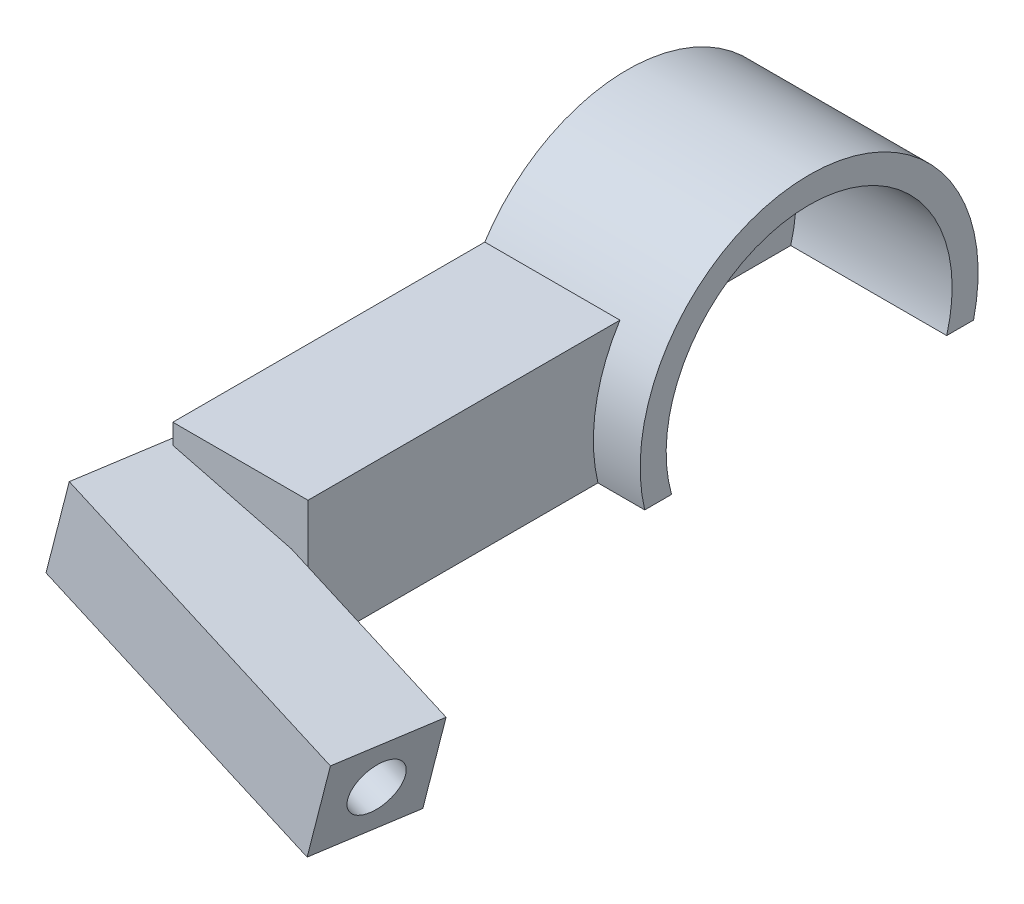
ISO-10303-21;
HEADER;
FILE_DESCRIPTION(('STEP AP214'),'2;1');
FILE_NAME('part.step','',(''),(''),'','','');
FILE_SCHEMA(('AUTOMOTIVE_DESIGN { 1 0 10303 214 1 1 1 1 }'));
ENDSEC;
DATA;
#1=APPLICATION_CONTEXT('core data for automotive mechanical design processes');
#2=APPLICATION_PROTOCOL_DEFINITION('international standard','automotive_design',2000,#1);
#3=PRODUCT_CONTEXT('',#1,'mechanical');
#4=PRODUCT('Part','Part','',(#3));
#5=PRODUCT_RELATED_PRODUCT_CATEGORY('part','',(#4));
#6=PRODUCT_DEFINITION_FORMATION('','',#4);
#7=PRODUCT_DEFINITION_CONTEXT('part definition',#1,'design');
#8=PRODUCT_DEFINITION('design','',#6,#7);
#9=PRODUCT_DEFINITION_SHAPE('','',#8);
#10=(LENGTH_UNIT() NAMED_UNIT(*) SI_UNIT(.MILLI.,.METRE.));
#11=(NAMED_UNIT(*) PLANE_ANGLE_UNIT() SI_UNIT($,.RADIAN.));
#12=(NAMED_UNIT(*) SI_UNIT($,.STERADIAN.) SOLID_ANGLE_UNIT());
#13=UNCERTAINTY_MEASURE_WITH_UNIT(LENGTH_MEASURE(1.E-05),#10,'distance_accuracy_value','');
#14=(GEOMETRIC_REPRESENTATION_CONTEXT(3) GLOBAL_UNCERTAINTY_ASSIGNED_CONTEXT((#13)) GLOBAL_UNIT_ASSIGNED_CONTEXT((#10,
#11,#12)) REPRESENTATION_CONTEXT('',''));
#15=CARTESIAN_POINT('',(0.,0.,0.));
#16=DIRECTION('',(0.,0.,1.));
#17=DIRECTION('',(1.,0.,0.));
#18=AXIS2_PLACEMENT_3D('',#15,#16,#17);
#19=CARTESIAN_POINT('',(26.,-7.5,87.3861278752583));
#20=DIRECTION('',(0.,0.,1.));
#21=DIRECTION('',(1.,0.,0.));
#22=AXIS2_PLACEMENT_3D('',#19,#20,#21);
#23=PLANE('',#22);
#24=DIRECTION('',(0.968617172297237,-0.248557384784488,0.));
#25=VECTOR('',#24,1.);
#26=CARTESIAN_POINT('',(25.0126337091881,-11.3477229129888,87.3861278752583));
#27=LINE('',#26,#25);
#28=CARTESIAN_POINT('',(0.,-4.92921723382223,87.3861278752583));
#29=VERTEX_POINT('',#28);
#30=CARTESIAN_POINT('',(10.0182271217756,-7.5,87.3861278752583));
#31=VERTEX_POINT('',#30);
#32=EDGE_CURVE('E11',#29,#31,#27,.T.);
#33=ORIENTED_EDGE('',*,*,#32,.F.);
#34=DIRECTION('',(0.,1.,0.));
#35=VECTOR('',#34,1.);
#36=CARTESIAN_POINT('',(0.,-7.5,87.3861278752583));
#37=LINE('',#36,#35);
#38=CARTESIAN_POINT('',(0.,-7.5,87.3861278752583));
#39=VERTEX_POINT('',#38);
#40=EDGE_CURVE('E253',#39,#29,#37,.T.);
#41=ORIENTED_EDGE('',*,*,#40,.F.);
#42=DIRECTION('',(-1.,0.,0.));
#43=VECTOR('',#42,1.);
#44=CARTESIAN_POINT('',(26.,-7.5,87.3861278752583));
#45=LINE('',#44,#43);
#46=EDGE_CURVE('E252',#31,#39,#45,.T.);
#47=ORIENTED_EDGE('',*,*,#46,.F.);
#48=EDGE_LOOP('',(#33,#41,#47));
#49=FACE_BOUND('',#48,.T.);
#50=ADVANCED_FACE('F45',(#49),#23,.T.);
#51=CARTESIAN_POINT('',(35.,0.,0.));
#52=DIRECTION('',(-1.,0.,0.));
#53=DIRECTION('',(0.,0.,1.));
#54=AXIS2_PLACEMENT_3D('',#51,#52,#53);
#55=CYLINDRICAL_SURFACE('',#54,32.5);
#56=CARTESIAN_POINT('',(0.,0.,0.));
#57=DIRECTION('',(1.,0.,0.));
#58=DIRECTION('',(0.,0.,-1.));
#59=AXIS2_PLACEMENT_3D('',#56,#57,#58);
#60=CIRCLE('',#59,32.5);
#61=CARTESIAN_POINT('',(0.,-7.5,-31.6227766016838));
#62=VERTEX_POINT('',#61);
#63=CARTESIAN_POINT('',(0.,17.5,27.3861278752583));
#64=VERTEX_POINT('',#63);
#65=EDGE_CURVE('E270',#62,#64,#60,.T.);
#66=ORIENTED_EDGE('',*,*,#65,.T.);
#67=DIRECTION('',(-1.,0.,0.));
#68=VECTOR('',#67,1.);
#69=CARTESIAN_POINT('',(26.,17.5,27.3861278752583));
#70=LINE('',#69,#68);
#71=CARTESIAN_POINT('',(26.,17.5,27.3861278752583));
#72=VERTEX_POINT('',#71);
#73=EDGE_CURVE('E258',#72,#64,#70,.T.);
#74=ORIENTED_EDGE('',*,*,#73,.F.);
#75=CARTESIAN_POINT('',(26.,0.,0.));
#76=DIRECTION('',(1.,0.,0.));
#77=DIRECTION('',(0.,0.,-1.));
#78=AXIS2_PLACEMENT_3D('',#75,#76,#77);
#79=CIRCLE('',#78,32.5);
#80=CARTESIAN_POINT('',(26.,-7.5,31.6227766016838));
#81=VERTEX_POINT('',#80);
#82=EDGE_CURVE('E262',#72,#81,#79,.T.);
#83=ORIENTED_EDGE('',*,*,#82,.T.);
#84=DIRECTION('',(-1.,0.,0.));
#85=VECTOR('',#84,1.);
#86=CARTESIAN_POINT('',(35.,-7.5,31.6227766016838));
#87=LINE('',#86,#85);
#88=CARTESIAN_POINT('',(35.,-7.5,31.6227766016838));
#89=VERTEX_POINT('',#88);
#90=EDGE_CURVE('E289',#89,#81,#87,.T.);
#91=ORIENTED_EDGE('',*,*,#90,.F.);
#92=CARTESIAN_POINT('',(35.,0.,0.));
#93=DIRECTION('',(1.,0.,0.));
#94=DIRECTION('',(0.,0.,-1.));
#95=AXIS2_PLACEMENT_3D('',#92,#93,#94);
#96=CIRCLE('',#95,32.5);
#97=CARTESIAN_POINT('',(35.,-7.5,-31.6227766016838));
#98=VERTEX_POINT('',#97);
#99=EDGE_CURVE('E271',#98,#89,#96,.T.);
#100=ORIENTED_EDGE('',*,*,#99,.F.);
#101=DIRECTION('',(-1.,0.,0.));
#102=VECTOR('',#101,1.);
#103=CARTESIAN_POINT('',(35.,-7.5,-31.6227766016838));
#104=LINE('',#103,#102);
#105=EDGE_CURVE('E281',#98,#62,#104,.T.);
#106=ORIENTED_EDGE('',*,*,#105,.T.);
#107=EDGE_LOOP('',(#66,#74,#83,#91,#100,#106));
#108=FACE_BOUND('',#107,.T.);
#109=ADVANCED_FACE('F47',(#108),#55,.T.);
#110=CARTESIAN_POINT('',(35.,-7.5,31.6227766016838));
#111=DIRECTION('',(0.,1.,0.));
#112=DIRECTION('',(0.,0.,1.));
#113=AXIS2_PLACEMENT_3D('',#110,#111,#112);
#114=PLANE('',#113);
#115=DIRECTION('',(-0.992748113539216,0.,-0.120213073599875));
#116=VECTOR('',#115,1.);
#117=CARTESIAN_POINT('',(28.1125658667328,-7.5,88.5008435054958));
#118=LINE('',#117,#116);
#119=CARTESIAN_POINT('',(18.9069794366387,-7.5,87.3861278752583));
#120=VERTEX_POINT('',#119);
#121=CARTESIAN_POINT('',(10.0182271217757,-7.50000000000001,86.3097780724586));
#122=VERTEX_POINT('',#121);
#123=EDGE_CURVE('E60',#120,#122,#118,.T.);
#124=ORIENTED_EDGE('',*,*,#123,.T.);
#125=DIRECTION('',(0.,0.,1.));
#126=VECTOR('',#125,1.);
#127=CARTESIAN_POINT('',(10.0182271217756,-7.5,31.6227766016838));
#128=LINE('',#127,#126);
#129=EDGE_CURVE('E226',#122,#31,#128,.T.);
#130=ORIENTED_EDGE('',*,*,#129,.T.);
#131=ORIENTED_EDGE('',*,*,#46,.T.);
#132=DIRECTION('',(0.,0.,-1.));
#133=VECTOR('',#132,1.);
#134=CARTESIAN_POINT('',(0.,-7.5,31.6227766016838));
#135=LINE('',#134,#133);
#136=EDGE_CURVE('E276',#39,#62,#135,.T.);
#137=ORIENTED_EDGE('',*,*,#136,.T.);
#138=ORIENTED_EDGE('',*,*,#105,.F.);
#139=DIRECTION('',(0.,0.,-1.));
#140=VECTOR('',#139,1.);
#141=CARTESIAN_POINT('',(35.,-7.5,31.6227766016838));
#142=LINE('',#141,#140);
#143=CARTESIAN_POINT('',(35.,-7.5,-26.4575131106459));
#144=VERTEX_POINT('',#143);
#145=EDGE_CURVE('E275',#144,#98,#142,.T.);
#146=ORIENTED_EDGE('',*,*,#145,.F.);
#147=DIRECTION('',(1.,0.,0.));
#148=VECTOR('',#147,1.);
#149=CARTESIAN_POINT('',(5.,-7.5,-26.4575131106459));
#150=LINE('',#149,#148);
#151=CARTESIAN_POINT('',(5.,-7.5,-26.4575131106459));
#152=VERTEX_POINT('',#151);
#153=EDGE_CURVE('E232',#144,#152,#150,.F.);
#154=ORIENTED_EDGE('',*,*,#153,.T.);
#155=DIRECTION('',(0.,0.,-1.));
#156=VECTOR('',#155,1.);
#157=CARTESIAN_POINT('',(5.,-7.5,31.6227766016838));
#158=LINE('',#157,#156);
#159=CARTESIAN_POINT('',(5.,-7.5,26.4575131106459));
#160=VERTEX_POINT('',#159);
#161=EDGE_CURVE('E296',#160,#152,#158,.T.);
#162=ORIENTED_EDGE('',*,*,#161,.F.);
#163=DIRECTION('',(1.,0.,0.));
#164=VECTOR('',#163,1.);
#165=CARTESIAN_POINT('',(5.,-7.5,26.4575131106459));
#166=LINE('',#165,#164);
#167=CARTESIAN_POINT('',(35.,-7.5,26.4575131106459));
#168=VERTEX_POINT('',#167);
#169=EDGE_CURVE('E236',#160,#168,#166,.T.);
#170=ORIENTED_EDGE('',*,*,#169,.T.);
#171=EDGE_CURVE('E277',#89,#168,#142,.T.);
#172=ORIENTED_EDGE('',*,*,#171,.F.);
#173=ORIENTED_EDGE('',*,*,#90,.T.);
#174=DIRECTION('',(0.,0.,1.));
#175=VECTOR('',#174,1.);
#176=CARTESIAN_POINT('',(26.,-7.5,27.3861278752583));
#177=LINE('',#176,#175);
#178=CARTESIAN_POINT('',(26.,-7.5,87.3861278752583));
#179=VERTEX_POINT('',#178);
#180=EDGE_CURVE('E241',#81,#179,#177,.T.);
#181=ORIENTED_EDGE('',*,*,#180,.T.);
#182=EDGE_CURVE('E266',#179,#120,#45,.T.);
#183=ORIENTED_EDGE('',*,*,#182,.T.);
#184=EDGE_LOOP('',(#124,#130,#131,#137,#138,#146,#154,#162,#170,#172,#173,#181,#183));
#185=FACE_BOUND('',#184,.T.);
#186=ADVANCED_FACE('F313',(#185),#114,.F.);
#187=CARTESIAN_POINT('',(35.,0.,0.));
#188=DIRECTION('',(1.,0.,0.));
#189=DIRECTION('',(0.,0.,-1.));
#190=AXIS2_PLACEMENT_3D('',#187,#188,#189);
#191=PLANE('',#190);
#192=CARTESIAN_POINT('',(35.,0.,0.));
#193=DIRECTION('',(1.,0.,0.));
#194=DIRECTION('',(0.,0.,-1.));
#195=AXIS2_PLACEMENT_3D('',#192,#193,#194);
#196=CIRCLE('',#195,27.5);
#197=EDGE_CURVE('E293',#144,#168,#196,.T.);
#198=ORIENTED_EDGE('',*,*,#197,.F.);
#199=ORIENTED_EDGE('',*,*,#145,.T.);
#200=ORIENTED_EDGE('',*,*,#99,.T.);
#201=ORIENTED_EDGE('',*,*,#171,.T.);
#202=EDGE_LOOP('',(#198,#199,#200,#201));
#203=FACE_BOUND('',#202,.T.);
#204=ADVANCED_FACE('F338',(#203),#191,.T.);
#205=CARTESIAN_POINT('',(0.,0.,0.));
#206=DIRECTION('',(1.,0.,0.));
#207=DIRECTION('',(0.,0.,-1.));
#208=AXIS2_PLACEMENT_3D('',#205,#206,#207);
#209=PLANE('',#208);
#210=ORIENTED_EDGE('',*,*,#40,.T.);
#211=DIRECTION('',(0.,0.,-1.));
#212=VECTOR('',#211,1.);
#213=CARTESIAN_POINT('',(0.,-4.92921723382223,0.));
#214=LINE('',#213,#212);
#215=CARTESIAN_POINT('',(0.,-4.92921723382223,85.0167761349901));
#216=VERTEX_POINT('',#215);
#217=EDGE_CURVE('E68',#29,#216,#214,.T.);
#218=ORIENTED_EDGE('',*,*,#217,.T.);
#219=DIRECTION('',(0.,0.999517574874155,-0.0310582922532324));
#220=VECTOR('',#219,1.);
#221=CARTESIAN_POINT('',(0.,2.6344472384274,84.7817482499485));
#222=LINE('',#221,#220);
#223=CARTESIAN_POINT('',(0.,13.6539759149323,84.4393353192196));
#224=VERTEX_POINT('',#223);
#225=EDGE_CURVE('E223',#216,#224,#222,.T.);
#226=ORIENTED_EDGE('',*,*,#225,.T.);
#227=DIRECTION('',(0.,0.,1.));
#228=VECTOR('',#227,1.);
#229=CARTESIAN_POINT('',(0.,13.6539759149323,0.));
#230=LINE('',#229,#228);
#231=CARTESIAN_POINT('',(0.,13.6539759149323,87.3861278752583));
#232=VERTEX_POINT('',#231);
#233=EDGE_CURVE('E212',#224,#232,#230,.T.);
#234=ORIENTED_EDGE('',*,*,#233,.T.);
#235=CARTESIAN_POINT('',(0.,17.5,87.3861278752583));
#236=VERTEX_POINT('',#235);
#237=EDGE_CURVE('E240',#232,#236,#37,.T.);
#238=ORIENTED_EDGE('',*,*,#237,.T.);
#239=DIRECTION('',(0.,0.,-1.));
#240=VECTOR('',#239,1.);
#241=CARTESIAN_POINT('',(0.,17.5,27.3861278752583));
#242=LINE('',#241,#240);
#243=EDGE_CURVE('E245',#236,#64,#242,.T.);
#244=ORIENTED_EDGE('',*,*,#243,.T.);
#245=ORIENTED_EDGE('',*,*,#65,.F.);
#246=ORIENTED_EDGE('',*,*,#136,.F.);
#247=EDGE_LOOP('',(#210,#218,#226,#234,#238,#244,#245,#246));
#248=FACE_BOUND('',#247,.T.);
#249=ADVANCED_FACE('F317',(#248),#209,.F.);
#250=CARTESIAN_POINT('',(26.,0.,0.));
#251=DIRECTION('',(1.,0.,0.));
#252=DIRECTION('',(0.,0.,-1.));
#253=AXIS2_PLACEMENT_3D('',#250,#251,#252);
#254=PLANE('',#253);
#255=ORIENTED_EDGE('',*,*,#82,.F.);
#256=DIRECTION('',(0.,0.,-1.));
#257=VECTOR('',#256,1.);
#258=CARTESIAN_POINT('',(26.,17.5,27.3861278752583));
#259=LINE('',#258,#257);
#260=CARTESIAN_POINT('',(26.,17.5,87.3861278752583));
#261=VERTEX_POINT('',#260);
#262=EDGE_CURVE('E248',#261,#72,#259,.T.);
#263=ORIENTED_EDGE('',*,*,#262,.F.);
#264=DIRECTION('',(0.,1.,0.));
#265=VECTOR('',#264,1.);
#266=CARTESIAN_POINT('',(26.,-7.5,87.3861278752583));
#267=LINE('',#266,#265);
#268=EDGE_CURVE('E244',#179,#261,#267,.T.);
#269=ORIENTED_EDGE('',*,*,#268,.F.);
#270=ORIENTED_EDGE('',*,*,#180,.F.);
#271=EDGE_LOOP('',(#255,#263,#269,#270));
#272=FACE_BOUND('',#271,.T.);
#273=ADVANCED_FACE('F333',(#272),#254,.T.);
#274=CARTESIAN_POINT('',(26.,17.5,27.3861278752583));
#275=DIRECTION('',(0.,1.,0.));
#276=DIRECTION('',(0.,0.,1.));
#277=AXIS2_PLACEMENT_3D('',#274,#275,#276);
#278=PLANE('',#277);
#279=ORIENTED_EDGE('',*,*,#243,.F.);
#280=DIRECTION('',(-1.,0.,0.));
#281=VECTOR('',#280,1.);
#282=CARTESIAN_POINT('',(26.,17.5,87.3861278752583));
#283=LINE('',#282,#281);
#284=EDGE_CURVE('E263',#261,#236,#283,.T.);
#285=ORIENTED_EDGE('',*,*,#284,.F.);
#286=ORIENTED_EDGE('',*,*,#262,.T.);
#287=ORIENTED_EDGE('',*,*,#73,.T.);
#288=EDGE_LOOP('',(#279,#285,#286,#287));
#289=FACE_BOUND('',#288,.T.);
#290=ADVANCED_FACE('F327',(#289),#278,.T.);
#291=DIRECTION('',(0.248557384784488,0.968617172297237,0.));
#292=VECTOR('',#291,1.);
#293=CARTESIAN_POINT('',(19.3451917337137,-5.79230599434106,87.3861278752583));
#294=LINE('',#293,#292);
#295=CARTESIAN_POINT('',(22.8318583690233,7.79508019402019,87.3861278752584));
#296=VERTEX_POINT('',#295);
#297=EDGE_CURVE('E53',#120,#296,#294,.T.);
#298=ORIENTED_EDGE('',*,*,#297,.F.);
#299=ORIENTED_EDGE('',*,*,#182,.F.);
#300=ORIENTED_EDGE('',*,*,#268,.T.);
#301=ORIENTED_EDGE('',*,*,#284,.T.);
#302=ORIENTED_EDGE('',*,*,#237,.F.);
#303=DIRECTION('',(-0.968617172297237,0.248557384784488,0.));
#304=VECTOR('',#303,1.);
#305=CARTESIAN_POINT('',(29.4866666353089,6.08738618836143,87.3861278752583));
#306=LINE('',#305,#304);
#307=EDGE_CURVE('E299',#296,#232,#306,.T.);
#308=ORIENTED_EDGE('',*,*,#307,.F.);
#309=EDGE_LOOP('',(#298,#299,#300,#301,#302,#308));
#310=FACE_BOUND('',#309,.T.);
#311=ADVANCED_FACE('F323',(#310),#23,.T.);
#312=CARTESIAN_POINT('',(5.,0.,0.));
#313=DIRECTION('',(1.,0.,0.));
#314=DIRECTION('',(0.,0.,-1.));
#315=AXIS2_PLACEMENT_3D('',#312,#313,#314);
#316=PLANE('',#315);
#317=ORIENTED_EDGE('',*,*,#161,.T.);
#318=CARTESIAN_POINT('',(5.,0.,0.));
#319=DIRECTION('',(1.,0.,0.));
#320=DIRECTION('',(0.,0.,-1.));
#321=AXIS2_PLACEMENT_3D('',#318,#319,#320);
#322=CIRCLE('',#321,27.5);
#323=EDGE_CURVE('E228',#152,#160,#322,.T.);
#324=ORIENTED_EDGE('',*,*,#323,.T.);
#325=EDGE_LOOP('',(#317,#324));
#326=FACE_BOUND('',#325,.T.);
#327=ADVANCED_FACE('F346',(#326),#316,.T.);
#328=CARTESIAN_POINT('',(5.,0.,0.));
#329=DIRECTION('',(1.,0.,0.));
#330=DIRECTION('',(0.,0.,-1.));
#331=AXIS2_PLACEMENT_3D('',#328,#329,#330);
#332=CYLINDRICAL_SURFACE('',#331,27.5);
#333=ORIENTED_EDGE('',*,*,#323,.F.);
#334=ORIENTED_EDGE('',*,*,#153,.F.);
#335=ORIENTED_EDGE('',*,*,#197,.T.);
#336=ORIENTED_EDGE('',*,*,#169,.F.);
#337=EDGE_LOOP('',(#333,#334,#335,#336));
#338=FACE_BOUND('',#337,.T.);
#339=ADVANCED_FACE('F344',(#338),#332,.F.);
#340=CARTESIAN_POINT('',(52.4876982856572,-18.3981143299773,91.7910980535962));
#341=DIRECTION('',(-0.248557384784488,-0.968617172297237,0.));
#342=DIRECTION('',(0.968617172297237,-0.248557384784488,0.));
#343=AXIS2_PLACEMENT_3D('',#340,#341,#342);
#344=PLANE('',#343);
#345=ORIENTED_EDGE('',*,*,#129,.F.);
#346=DIRECTION('',(-0.961135673051981,0.246637553152495,-0.124048923259596));
#347=VECTOR('',#346,1.);
#348=CARTESIAN_POINT('',(52.4876982856572,-18.3981143299773,91.7910980535962));
#349=LINE('',#348,#347);
#350=CARTESIAN_POINT('',(52.4876982856572,-18.3981143299773,91.7910980535962));
#351=VERTEX_POINT('',#350);
#352=EDGE_CURVE('E213',#351,#122,#349,.T.);
#353=ORIENTED_EDGE('',*,*,#352,.F.);
#354=DIRECTION('',(-0.120155917274227,0.0308332759507369,0.992276103026841));
#355=VECTOR('',#354,1.);
#356=CARTESIAN_POINT('',(52.4876982856572,-18.3981143299773,91.7910980535962));
#357=LINE('',#356,#355);
#358=CARTESIAN_POINT('',(50.0845799401726,-17.7814488109626,111.636620114133));
#359=VERTEX_POINT('',#358);
#360=EDGE_CURVE('E175',#351,#359,#357,.T.);
#361=ORIENTED_EDGE('',*,*,#360,.T.);
#362=DIRECTION('',(-0.961135673051981,0.246637553152495,-0.124048923259596));
#363=VECTOR('',#362,1.);
#364=CARTESIAN_POINT('',(50.0845799401726,-17.7814488109626,111.636620114133));
#365=LINE('',#364,#363);
#366=CARTESIAN_POINT('',(-7.58356044294624,-2.98319562181288,104.193684718557));
#367=VERTEX_POINT('',#366);
#368=EDGE_CURVE('E210',#359,#367,#365,.T.);
#369=ORIENTED_EDGE('',*,*,#368,.T.);
#370=DIRECTION('',(-0.120155917274227,0.0308332759507369,0.992276103026841));
#371=VECTOR('',#370,1.);
#372=CARTESIAN_POINT('',(-5.18044209746169,-3.59986114082761,84.3481626580205));
#373=LINE('',#372,#371);
#374=CARTESIAN_POINT('',(-5.18044209746169,-3.59986114082761,84.3481626580205));
#375=VERTEX_POINT('',#374);
#376=EDGE_CURVE('E191',#375,#367,#373,.T.);
#377=ORIENTED_EDGE('',*,*,#376,.F.);
#378=EDGE_CURVE('E216',#216,#375,#349,.T.);
#379=ORIENTED_EDGE('',*,*,#378,.F.);
#380=ORIENTED_EDGE('',*,*,#217,.F.);
#381=ORIENTED_EDGE('',*,*,#32,.T.);
#382=EDGE_LOOP('',(#345,#353,#361,#369,#377,#379,#380,#381));
#383=FACE_BOUND('',#382,.T.);
#384=ADVANCED_FACE('F311',(#383),#344,.T.);
#385=CARTESIAN_POINT('',(52.4876982856572,-18.3981143299773,91.7910980535962));
#386=DIRECTION('',(0.120155917274227,-0.0308332759507369,-0.992276103026841));
#387=DIRECTION('',(-0.992748113539216,0.,-0.120213073599875));
#388=AXIS2_PLACEMENT_3D('',#385,#386,#387);
#389=PLANE('',#388);
#390=ORIENTED_EDGE('',*,*,#225,.F.);
#391=ORIENTED_EDGE('',*,*,#378,.T.);
#392=DIRECTION('',(-0.248557384784488,-0.968617172297237,0.));
#393=VECTOR('',#392,1.);
#394=CARTESIAN_POINT('',(-5.18044209746169,-3.59986114082761,84.3481626580205));
#395=LINE('',#394,#393);
#396=CARTESIAN_POINT('',(-0.706409171340908,13.8352479605227,84.3481626580205));
#397=VERTEX_POINT('',#396);
#398=EDGE_CURVE('E185',#397,#375,#395,.T.);
#399=ORIENTED_EDGE('',*,*,#398,.F.);
#400=DIRECTION('',(-0.961135673051981,0.246637553152495,-0.124048923259596));
#401=VECTOR('',#400,1.);
#402=CARTESIAN_POINT('',(56.961731211778,-0.963005228627046,91.7910980535962));
#403=LINE('',#402,#401);
#404=EDGE_CURVE('E174',#224,#397,#403,.T.);
#405=ORIENTED_EDGE('',*,*,#404,.F.);
#406=EDGE_LOOP('',(#390,#391,#399,#405));
#407=FACE_BOUND('',#406,.T.);
#408=ADVANCED_FACE('F321',(#407),#389,.T.);
#409=ORIENTED_EDGE('',*,*,#123,.F.);
#410=ORIENTED_EDGE('',*,*,#297,.T.);
#411=CARTESIAN_POINT('',(56.961731211778,-0.963005228627046,91.7910980535962));
#412=VERTEX_POINT('',#411);
#413=EDGE_CURVE('E217',#412,#296,#403,.T.);
#414=ORIENTED_EDGE('',*,*,#413,.F.);
#415=DIRECTION('',(-0.248557384784488,-0.968617172297237,0.));
#416=VECTOR('',#415,1.);
#417=CARTESIAN_POINT('',(52.4876982856572,-18.3981143299773,91.7910980535962));
#418=LINE('',#417,#416);
#419=EDGE_CURVE('E205',#412,#351,#418,.T.);
#420=ORIENTED_EDGE('',*,*,#419,.T.);
#421=ORIENTED_EDGE('',*,*,#352,.T.);
#422=EDGE_LOOP('',(#409,#410,#414,#420,#421));
#423=FACE_BOUND('',#422,.T.);
#424=ADVANCED_FACE('F303',(#423),#389,.T.);
#425=CARTESIAN_POINT('',(56.961731211778,-0.963005228627046,91.7910980535962));
#426=DIRECTION('',(0.248557384784488,0.968617172297237,0.));
#427=DIRECTION('',(-0.968617172297237,0.248557384784488,0.));
#428=AXIS2_PLACEMENT_3D('',#425,#426,#427);
#429=PLANE('',#428);
#430=ORIENTED_EDGE('',*,*,#233,.F.);
#431=ORIENTED_EDGE('',*,*,#404,.T.);
#432=DIRECTION('',(0.120155917274227,-0.0308332759507369,-0.992276103026841));
#433=VECTOR('',#432,1.);
#434=CARTESIAN_POINT('',(-0.706409171340908,13.8352479605227,84.3481626580205));
#435=LINE('',#434,#433);
#436=CARTESIAN_POINT('',(-3.10952751682545,14.4519134795374,104.193684718557));
#437=VERTEX_POINT('',#436);
#438=EDGE_CURVE('E178',#437,#397,#435,.T.);
#439=ORIENTED_EDGE('',*,*,#438,.F.);
#440=DIRECTION('',(-0.961135673051981,0.246637553152495,-0.124048923259596));
#441=VECTOR('',#440,1.);
#442=CARTESIAN_POINT('',(54.5586128662934,-0.346339709612307,111.636620114133));
#443=LINE('',#442,#441);
#444=CARTESIAN_POINT('',(54.5586128662934,-0.346339709612307,111.636620114133));
#445=VERTEX_POINT('',#444);
#446=EDGE_CURVE('E164',#445,#437,#443,.T.);
#447=ORIENTED_EDGE('',*,*,#446,.F.);
#448=DIRECTION('',(0.120155917274227,-0.0308332759507369,-0.992276103026841));
#449=VECTOR('',#448,1.);
#450=CARTESIAN_POINT('',(56.961731211778,-0.963005228627046,91.7910980535962));
#451=LINE('',#450,#449);
#452=EDGE_CURVE('E203',#445,#412,#451,.T.);
#453=ORIENTED_EDGE('',*,*,#452,.T.);
#454=ORIENTED_EDGE('',*,*,#413,.T.);
#455=ORIENTED_EDGE('',*,*,#307,.T.);
#456=EDGE_LOOP('',(#430,#431,#439,#447,#453,#454,#455));
#457=FACE_BOUND('',#456,.T.);
#458=ADVANCED_FACE('F180',(#457),#429,.T.);
#459=CARTESIAN_POINT('',(50.0845799401726,-17.7814488109626,111.636620114133));
#460=DIRECTION('',(-0.120155917274227,0.0308332759507369,0.992276103026841));
#461=DIRECTION('',(0.992748113539216,0.,0.120213073599875));
#462=AXIS2_PLACEMENT_3D('',#459,#460,#461);
#463=PLANE('',#462);
#464=ORIENTED_EDGE('',*,*,#446,.T.);
#465=DIRECTION('',(0.248557384784488,0.968617172297237,0.));
#466=VECTOR('',#465,1.);
#467=CARTESIAN_POINT('',(-7.58356044294624,-2.98319562181288,104.193684718557));
#468=LINE('',#467,#466);
#469=EDGE_CURVE('E168',#367,#437,#468,.T.);
#470=ORIENTED_EDGE('',*,*,#469,.F.);
#471=ORIENTED_EDGE('',*,*,#368,.F.);
#472=DIRECTION('',(0.248557384784488,0.968617172297237,0.));
#473=VECTOR('',#472,1.);
#474=CARTESIAN_POINT('',(50.0845799401726,-17.7814488109626,111.636620114133));
#475=LINE('',#474,#473);
#476=EDGE_CURVE('E170',#359,#445,#475,.T.);
#477=ORIENTED_EDGE('',*,*,#476,.T.);
#478=EDGE_LOOP('',(#464,#470,#471,#477));
#479=FACE_BOUND('',#478,.T.);
#480=ADVANCED_FACE('F166',(#479),#463,.T.);
#481=CARTESIAN_POINT('',(63.7925468690009,-16.3698405025128,8.23338158488984));
#482=DIRECTION('',(0.961135673051981,-0.246637553152495,0.124048923259596));
#483=DIRECTION('',(0.248557384784488,0.968617172297237,0.));
#484=AXIS2_PLACEMENT_3D('',#481,#482,#483);
#485=PLANE('',#484);
#486=CARTESIAN_POINT('',(53.5231555759753,-9.37222701979481,101.713859083865));
#487=DIRECTION('',(-0.961135673051981,0.246637553152495,-0.124048923259596));
#488=DIRECTION('',(-0.248557384784488,-0.968617172297237,0.));
#489=AXIS2_PLACEMENT_3D('',#486,#487,#488);
#490=CIRCLE('',#489,5.);
#491=CARTESIAN_POINT('',(52.2803686520529,-14.215312881281,101.713859083865));
#492=VERTEX_POINT('',#491);
#493=EDGE_CURVE('E199',#492,#492,#490,.T.);
#494=ORIENTED_EDGE('',*,*,#493,.T.);
#495=EDGE_LOOP('',(#494));
#496=FACE_BOUND('',#495,.T.);
#497=ORIENTED_EDGE('',*,*,#476,.F.);
#498=ORIENTED_EDGE('',*,*,#360,.F.);
#499=ORIENTED_EDGE('',*,*,#419,.F.);
#500=ORIENTED_EDGE('',*,*,#452,.F.);
#501=EDGE_LOOP('',(#497,#498,#499,#500));
#502=FACE_BOUND('',#501,.T.);
#503=ADVANCED_FACE('F308',(#496,#502),#485,.T.);
#504=CARTESIAN_POINT('',(53.5231555759753,-9.37222701979481,101.713859083865));
#505=DIRECTION('',(-0.961135673051981,0.246637553152495,-0.124048923259596));
#506=DIRECTION('',(-0.248557384784488,-0.968617172297237,0.));
#507=AXIS2_PLACEMENT_3D('',#504,#505,#506);
#508=CYLINDRICAL_SURFACE('',#507,5.);
#509=ORIENTED_EDGE('',*,*,#493,.F.);
#510=EDGE_LOOP('',(#509));
#511=FACE_BOUND('',#510,.T.);
#512=CARTESIAN_POINT('',(-4.14498480714357,5.42602616935489,94.2709236882889));
#513=DIRECTION('',(-0.961135673051981,0.246637553152495,-0.124048923259596));
#514=DIRECTION('',(-0.248557384784488,-0.968617172297237,0.));
#515=AXIS2_PLACEMENT_3D('',#512,#513,#514);
#516=CIRCLE('',#515,5.);
#517=CARTESIAN_POINT('',(-5.38777173106601,0.582940307868699,94.2709236882889));
#518=VERTEX_POINT('',#517);
#519=EDGE_CURVE('E192',#518,#518,#516,.T.);
#520=ORIENTED_EDGE('',*,*,#519,.T.);
#521=EDGE_LOOP('',(#520));
#522=FACE_BOUND('',#521,.T.);
#523=ADVANCED_FACE('F441',(#511,#522),#508,.F.);
#524=CARTESIAN_POINT('',(6.12440648588199,-1.5715873133631,0.790446189314066));
#525=DIRECTION('',(0.961135673051981,-0.246637553152495,0.124048923259596));
#526=DIRECTION('',(0.248557384784488,0.968617172297237,0.));
#527=AXIS2_PLACEMENT_3D('',#524,#525,#526);
#528=PLANE('',#527);
#529=ORIENTED_EDGE('',*,*,#469,.T.);
#530=ORIENTED_EDGE('',*,*,#438,.T.);
#531=ORIENTED_EDGE('',*,*,#398,.T.);
#532=ORIENTED_EDGE('',*,*,#376,.T.);
#533=EDGE_LOOP('',(#529,#530,#531,#532));
#534=FACE_BOUND('',#533,.T.);
#535=ORIENTED_EDGE('',*,*,#519,.F.);
#536=EDGE_LOOP('',(#535));
#537=FACE_BOUND('',#536,.T.);
#538=ADVANCED_FACE('F188',(#534,#537),#528,.F.);
#539=CLOSED_SHELL('',(#50,#109,#186,#204,#249,#273,#290,#311,#327,#339,#384,#408,#424,#458,#480,
#503,#523,#538));
#540=MANIFOLD_SOLID_BREP('B2',#539);
#541=ADVANCED_BREP_SHAPE_REPRESENTATION('',(#18,#540),#14);
#542=SHAPE_DEFINITION_REPRESENTATION(#9,#541);
ENDSEC;
END-ISO-10303-21;
